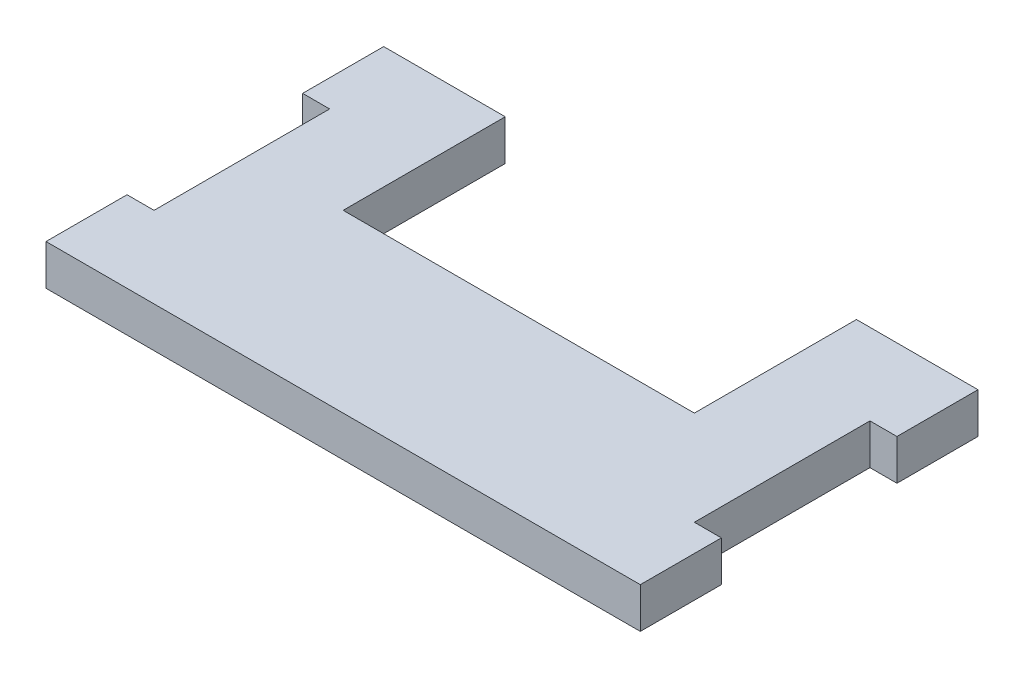
ISO-10303-21;
HEADER;
FILE_DESCRIPTION(('STEP AP214'),'2;1');
FILE_NAME('part.step','',(''),(''),'','','');
FILE_SCHEMA(('AUTOMOTIVE_DESIGN { 1 0 10303 214 1 1 1 1 }'));
ENDSEC;
DATA;
#1=APPLICATION_CONTEXT('core data for automotive mechanical design processes');
#2=APPLICATION_PROTOCOL_DEFINITION('international standard','automotive_design',2000,#1);
#3=PRODUCT_CONTEXT('',#1,'mechanical');
#4=PRODUCT('Part','Part','',(#3));
#5=PRODUCT_RELATED_PRODUCT_CATEGORY('part','',(#4));
#6=PRODUCT_DEFINITION_FORMATION('','',#4);
#7=PRODUCT_DEFINITION_CONTEXT('part definition',#1,'design');
#8=PRODUCT_DEFINITION('design','',#6,#7);
#9=PRODUCT_DEFINITION_SHAPE('','',#8);
#10=(LENGTH_UNIT() NAMED_UNIT(*) SI_UNIT(.MILLI.,.METRE.));
#11=(NAMED_UNIT(*) PLANE_ANGLE_UNIT() SI_UNIT($,.RADIAN.));
#12=(NAMED_UNIT(*) SI_UNIT($,.STERADIAN.) SOLID_ANGLE_UNIT());
#13=UNCERTAINTY_MEASURE_WITH_UNIT(LENGTH_MEASURE(1.E-05),#10,'distance_accuracy_value','');
#14=(GEOMETRIC_REPRESENTATION_CONTEXT(3) GLOBAL_UNCERTAINTY_ASSIGNED_CONTEXT((#13)) GLOBAL_UNIT_ASSIGNED_CONTEXT((#10,
#11,#12)) REPRESENTATION_CONTEXT('',''));
#15=CARTESIAN_POINT('',(0.,0.,0.));
#16=DIRECTION('',(0.,0.,1.));
#17=DIRECTION('',(1.,0.,0.));
#18=AXIS2_PLACEMENT_3D('',#15,#16,#17);
#19=CARTESIAN_POINT('',(0.,3.,-25.));
#20=DIRECTION('',(0.,0.,-1.));
#21=DIRECTION('',(-1.,0.,0.));
#22=AXIS2_PLACEMENT_3D('',#19,#20,#21);
#23=PLANE('',#22);
#24=DIRECTION('',(1.,0.,0.));
#25=VECTOR('',#24,1.);
#26=CARTESIAN_POINT('',(0.,0.,-25.));
#27=LINE('',#26,#25);
#28=CARTESIAN_POINT('',(33.,0.,-25.));
#29=VERTEX_POINT('',#28);
#30=CARTESIAN_POINT('',(42.,0.,-25.));
#31=VERTEX_POINT('',#30);
#32=EDGE_CURVE('E178',#29,#31,#27,.T.);
#33=ORIENTED_EDGE('',*,*,#32,.F.);
#34=DIRECTION('',(0.,-1.,0.));
#35=VECTOR('',#34,1.);
#36=CARTESIAN_POINT('',(33.,3.,-25.));
#37=LINE('',#36,#35);
#38=CARTESIAN_POINT('',(33.,3.,-25.));
#39=VERTEX_POINT('',#38);
#40=EDGE_CURVE('E11',#39,#29,#37,.T.);
#41=ORIENTED_EDGE('',*,*,#40,.F.);
#42=DIRECTION('',(1.,0.,0.));
#43=VECTOR('',#42,1.);
#44=CARTESIAN_POINT('',(0.,3.,-25.));
#45=LINE('',#44,#43);
#46=CARTESIAN_POINT('',(42.,3.,-25.));
#47=VERTEX_POINT('',#46);
#48=EDGE_CURVE('E219',#39,#47,#45,.T.);
#49=ORIENTED_EDGE('',*,*,#48,.T.);
#50=DIRECTION('',(0.,-1.,0.));
#51=VECTOR('',#50,1.);
#52=CARTESIAN_POINT('',(42.,3.,-25.));
#53=LINE('',#52,#51);
#54=EDGE_CURVE('E53',#47,#31,#53,.T.);
#55=ORIENTED_EDGE('',*,*,#54,.T.);
#56=EDGE_LOOP('',(#33,#41,#49,#55));
#57=FACE_BOUND('',#56,.T.);
#58=ADVANCED_FACE('F36',(#57),#23,.T.);
#59=CARTESIAN_POINT('',(33.,3.,0.));
#60=DIRECTION('',(1.,0.,0.));
#61=DIRECTION('',(0.,0.,-1.));
#62=AXIS2_PLACEMENT_3D('',#59,#60,#61);
#63=PLANE('',#62);
#64=DIRECTION('',(0.,0.,1.));
#65=VECTOR('',#64,1.);
#66=CARTESIAN_POINT('',(33.,0.,0.));
#67=LINE('',#66,#65);
#68=CARTESIAN_POINT('',(33.,0.,-13.));
#69=VERTEX_POINT('',#68);
#70=EDGE_CURVE('E180',#29,#69,#67,.T.);
#71=ORIENTED_EDGE('',*,*,#70,.T.);
#72=DIRECTION('',(0.,-1.,0.));
#73=VECTOR('',#72,1.);
#74=CARTESIAN_POINT('',(33.,3.,-13.));
#75=LINE('',#74,#73);
#76=CARTESIAN_POINT('',(33.,3.,-13.));
#77=VERTEX_POINT('',#76);
#78=EDGE_CURVE('E45',#77,#69,#75,.T.);
#79=ORIENTED_EDGE('',*,*,#78,.F.);
#80=DIRECTION('',(0.,0.,1.));
#81=VECTOR('',#80,1.);
#82=CARTESIAN_POINT('',(33.,3.,0.));
#83=LINE('',#82,#81);
#84=EDGE_CURVE('E265',#39,#77,#83,.T.);
#85=ORIENTED_EDGE('',*,*,#84,.F.);
#86=ORIENTED_EDGE('',*,*,#40,.T.);
#87=EDGE_LOOP('',(#71,#79,#85,#86));
#88=FACE_BOUND('',#87,.T.);
#89=ADVANCED_FACE('F38',(#88),#63,.F.);
#90=CARTESIAN_POINT('',(0.,3.,-13.));
#91=DIRECTION('',(0.,0.,-1.));
#92=DIRECTION('',(-1.,0.,0.));
#93=AXIS2_PLACEMENT_3D('',#90,#91,#92);
#94=PLANE('',#93);
#95=DIRECTION('',(1.,0.,0.));
#96=VECTOR('',#95,1.);
#97=CARTESIAN_POINT('',(0.,0.,-13.));
#98=LINE('',#97,#96);
#99=CARTESIAN_POINT('',(6.99999999999999,0.,-13.));
#100=VERTEX_POINT('',#99);
#101=EDGE_CURVE('E184',#100,#69,#98,.T.);
#102=ORIENTED_EDGE('',*,*,#101,.F.);
#103=DIRECTION('',(0.,-1.,0.));
#104=VECTOR('',#103,1.);
#105=CARTESIAN_POINT('',(6.99999999999999,3.,-13.));
#106=LINE('',#105,#104);
#107=CARTESIAN_POINT('',(6.99999999999999,3.,-13.));
#108=VERTEX_POINT('',#107);
#109=EDGE_CURVE('E242',#108,#100,#106,.T.);
#110=ORIENTED_EDGE('',*,*,#109,.F.);
#111=DIRECTION('',(1.,0.,0.));
#112=VECTOR('',#111,1.);
#113=CARTESIAN_POINT('',(0.,3.,-13.));
#114=LINE('',#113,#112);
#115=EDGE_CURVE('E249',#108,#77,#114,.T.);
#116=ORIENTED_EDGE('',*,*,#115,.T.);
#117=ORIENTED_EDGE('',*,*,#78,.T.);
#118=EDGE_LOOP('',(#102,#110,#116,#117));
#119=FACE_BOUND('',#118,.T.);
#120=ADVANCED_FACE('F247',(#119),#94,.T.);
#121=CARTESIAN_POINT('',(6.99999999999999,3.,0.));
#122=DIRECTION('',(1.,0.,0.));
#123=DIRECTION('',(0.,0.,-1.));
#124=AXIS2_PLACEMENT_3D('',#121,#122,#123);
#125=PLANE('',#124);
#126=DIRECTION('',(0.,0.,1.));
#127=VECTOR('',#126,1.);
#128=CARTESIAN_POINT('',(6.99999999999999,0.,0.));
#129=LINE('',#128,#127);
#130=CARTESIAN_POINT('',(6.99999999999999,0.,-25.));
#131=VERTEX_POINT('',#130);
#132=EDGE_CURVE('E187',#131,#100,#129,.T.);
#133=ORIENTED_EDGE('',*,*,#132,.F.);
#134=DIRECTION('',(0.,-1.,0.));
#135=VECTOR('',#134,1.);
#136=CARTESIAN_POINT('',(6.99999999999999,3.,-25.));
#137=LINE('',#136,#135);
#138=CARTESIAN_POINT('',(6.99999999999999,3.,-25.));
#139=VERTEX_POINT('',#138);
#140=EDGE_CURVE('E240',#139,#131,#137,.T.);
#141=ORIENTED_EDGE('',*,*,#140,.F.);
#142=DIRECTION('',(0.,0.,1.));
#143=VECTOR('',#142,1.);
#144=CARTESIAN_POINT('',(6.99999999999999,3.,0.));
#145=LINE('',#144,#143);
#146=EDGE_CURVE('E262',#139,#108,#145,.T.);
#147=ORIENTED_EDGE('',*,*,#146,.T.);
#148=ORIENTED_EDGE('',*,*,#109,.T.);
#149=EDGE_LOOP('',(#133,#141,#147,#148));
#150=FACE_BOUND('',#149,.T.);
#151=ADVANCED_FACE('F259',(#150),#125,.T.);
#152=CARTESIAN_POINT('',(-2.,0.,-25.));
#153=VERTEX_POINT('',#152);
#154=EDGE_CURVE('E181',#153,#131,#27,.T.);
#155=ORIENTED_EDGE('',*,*,#154,.F.);
#156=DIRECTION('',(0.,-1.,0.));
#157=VECTOR('',#156,1.);
#158=CARTESIAN_POINT('',(-2.,3.,-25.));
#159=LINE('',#158,#157);
#160=CARTESIAN_POINT('',(-2.,3.,-25.));
#161=VERTEX_POINT('',#160);
#162=EDGE_CURVE('E238',#161,#153,#159,.T.);
#163=ORIENTED_EDGE('',*,*,#162,.F.);
#164=EDGE_CURVE('E267',#161,#139,#45,.T.);
#165=ORIENTED_EDGE('',*,*,#164,.T.);
#166=ORIENTED_EDGE('',*,*,#140,.T.);
#167=EDGE_LOOP('',(#155,#163,#165,#166));
#168=FACE_BOUND('',#167,.T.);
#169=ADVANCED_FACE('F305',(#168),#23,.T.);
#170=CARTESIAN_POINT('',(-2.00000000000001,3.,0.));
#171=DIRECTION('',(1.,0.,0.));
#172=DIRECTION('',(0.,0.,-1.));
#173=AXIS2_PLACEMENT_3D('',#170,#171,#172);
#174=PLANE('',#173);
#175=DIRECTION('',(0.,0.,1.));
#176=VECTOR('',#175,1.);
#177=CARTESIAN_POINT('',(-2.00000000000001,0.,0.));
#178=LINE('',#177,#176);
#179=CARTESIAN_POINT('',(-2.,0.,-19.));
#180=VERTEX_POINT('',#179);
#181=EDGE_CURVE('E190',#153,#180,#178,.T.);
#182=ORIENTED_EDGE('',*,*,#181,.T.);
#183=DIRECTION('',(0.,-1.,0.));
#184=VECTOR('',#183,1.);
#185=CARTESIAN_POINT('',(-2.,3.,-19.));
#186=LINE('',#185,#184);
#187=CARTESIAN_POINT('',(-2.,3.,-19.));
#188=VERTEX_POINT('',#187);
#189=EDGE_CURVE('E236',#188,#180,#186,.T.);
#190=ORIENTED_EDGE('',*,*,#189,.F.);
#191=DIRECTION('',(0.,0.,1.));
#192=VECTOR('',#191,1.);
#193=CARTESIAN_POINT('',(-2.00000000000001,3.,0.));
#194=LINE('',#193,#192);
#195=EDGE_CURVE('E272',#161,#188,#194,.T.);
#196=ORIENTED_EDGE('',*,*,#195,.F.);
#197=ORIENTED_EDGE('',*,*,#162,.T.);
#198=EDGE_LOOP('',(#182,#190,#196,#197));
#199=FACE_BOUND('',#198,.T.);
#200=ADVANCED_FACE('F312',(#199),#174,.F.);
#201=CARTESIAN_POINT('',(0.,3.,-19.));
#202=DIRECTION('',(0.,0.,1.));
#203=DIRECTION('',(1.,0.,0.));
#204=AXIS2_PLACEMENT_3D('',#201,#202,#203);
#205=PLANE('',#204);
#206=DIRECTION('',(-1.,0.,0.));
#207=VECTOR('',#206,1.);
#208=CARTESIAN_POINT('',(0.,0.,-19.));
#209=LINE('',#208,#207);
#210=CARTESIAN_POINT('',(0.,0.,-19.));
#211=VERTEX_POINT('',#210);
#212=EDGE_CURVE('E193',#211,#180,#209,.T.);
#213=ORIENTED_EDGE('',*,*,#212,.F.);
#214=DIRECTION('',(0.,-1.,0.));
#215=VECTOR('',#214,1.);
#216=CARTESIAN_POINT('',(0.,3.,-19.));
#217=LINE('',#216,#215);
#218=CARTESIAN_POINT('',(0.,3.,-19.));
#219=VERTEX_POINT('',#218);
#220=EDGE_CURVE('E234',#219,#211,#217,.T.);
#221=ORIENTED_EDGE('',*,*,#220,.F.);
#222=DIRECTION('',(-1.,0.,0.));
#223=VECTOR('',#222,1.);
#224=CARTESIAN_POINT('',(0.,3.,-19.));
#225=LINE('',#224,#223);
#226=EDGE_CURVE('E274',#219,#188,#225,.T.);
#227=ORIENTED_EDGE('',*,*,#226,.T.);
#228=ORIENTED_EDGE('',*,*,#189,.T.);
#229=EDGE_LOOP('',(#213,#221,#227,#228));
#230=FACE_BOUND('',#229,.T.);
#231=ADVANCED_FACE('F318',(#230),#205,.T.);
#232=CARTESIAN_POINT('',(0.,3.,0.));
#233=DIRECTION('',(-1.,0.,0.));
#234=DIRECTION('',(0.,0.,1.));
#235=AXIS2_PLACEMENT_3D('',#232,#233,#234);
#236=PLANE('',#235);
#237=DIRECTION('',(0.,0.,-1.));
#238=VECTOR('',#237,1.);
#239=CARTESIAN_POINT('',(0.,0.,0.));
#240=LINE('',#239,#238);
#241=CARTESIAN_POINT('',(0.,0.,-5.99999999999999));
#242=VERTEX_POINT('',#241);
#243=EDGE_CURVE('E196',#242,#211,#240,.T.);
#244=ORIENTED_EDGE('',*,*,#243,.F.);
#245=DIRECTION('',(0.,-1.,0.));
#246=VECTOR('',#245,1.);
#247=CARTESIAN_POINT('',(0.,3.,-5.99999999999999));
#248=LINE('',#247,#246);
#249=CARTESIAN_POINT('',(0.,3.,-5.99999999999999));
#250=VERTEX_POINT('',#249);
#251=EDGE_CURVE('E232',#250,#242,#248,.T.);
#252=ORIENTED_EDGE('',*,*,#251,.F.);
#253=DIRECTION('',(0.,0.,-1.));
#254=VECTOR('',#253,1.);
#255=CARTESIAN_POINT('',(0.,3.,0.));
#256=LINE('',#255,#254);
#257=EDGE_CURVE('E277',#250,#219,#256,.T.);
#258=ORIENTED_EDGE('',*,*,#257,.T.);
#259=ORIENTED_EDGE('',*,*,#220,.T.);
#260=EDGE_LOOP('',(#244,#252,#258,#259));
#261=FACE_BOUND('',#260,.T.);
#262=ADVANCED_FACE('F328',(#261),#236,.T.);
#263=CARTESIAN_POINT('',(0.,3.,-6.));
#264=DIRECTION('',(0.,0.,1.));
#265=DIRECTION('',(1.,0.,0.));
#266=AXIS2_PLACEMENT_3D('',#263,#264,#265);
#267=PLANE('',#266);
#268=DIRECTION('',(-1.,0.,0.));
#269=VECTOR('',#268,1.);
#270=CARTESIAN_POINT('',(0.,0.,-6.));
#271=LINE('',#270,#269);
#272=CARTESIAN_POINT('',(-2.,0.,-5.99999999999999));
#273=VERTEX_POINT('',#272);
#274=EDGE_CURVE('E199',#242,#273,#271,.T.);
#275=ORIENTED_EDGE('',*,*,#274,.T.);
#276=DIRECTION('',(0.,-1.,0.));
#277=VECTOR('',#276,1.);
#278=CARTESIAN_POINT('',(-2.,3.,-5.99999999999999));
#279=LINE('',#278,#277);
#280=CARTESIAN_POINT('',(-2.,3.,-5.99999999999999));
#281=VERTEX_POINT('',#280);
#282=EDGE_CURVE('E230',#281,#273,#279,.T.);
#283=ORIENTED_EDGE('',*,*,#282,.F.);
#284=DIRECTION('',(-1.,0.,0.));
#285=VECTOR('',#284,1.);
#286=CARTESIAN_POINT('',(0.,3.,-6.));
#287=LINE('',#286,#285);
#288=EDGE_CURVE('E280',#250,#281,#287,.T.);
#289=ORIENTED_EDGE('',*,*,#288,.F.);
#290=ORIENTED_EDGE('',*,*,#251,.T.);
#291=EDGE_LOOP('',(#275,#283,#289,#290));
#292=FACE_BOUND('',#291,.T.);
#293=ADVANCED_FACE('F333',(#292),#267,.F.);
#294=CARTESIAN_POINT('',(-2.,3.,0.));
#295=DIRECTION('',(-1.,0.,0.));
#296=DIRECTION('',(0.,0.,1.));
#297=AXIS2_PLACEMENT_3D('',#294,#295,#296);
#298=PLANE('',#297);
#299=DIRECTION('',(0.,0.,-1.));
#300=VECTOR('',#299,1.);
#301=CARTESIAN_POINT('',(-2.,0.,0.));
#302=LINE('',#301,#300);
#303=CARTESIAN_POINT('',(-2.,0.,0.));
#304=VERTEX_POINT('',#303);
#305=EDGE_CURVE('E202',#304,#273,#302,.T.);
#306=ORIENTED_EDGE('',*,*,#305,.F.);
#307=DIRECTION('',(0.,-1.,0.));
#308=VECTOR('',#307,1.);
#309=CARTESIAN_POINT('',(-2.,3.,0.));
#310=LINE('',#309,#308);
#311=CARTESIAN_POINT('',(-2.,3.,0.));
#312=VERTEX_POINT('',#311);
#313=EDGE_CURVE('E228',#312,#304,#310,.T.);
#314=ORIENTED_EDGE('',*,*,#313,.F.);
#315=DIRECTION('',(0.,0.,-1.));
#316=VECTOR('',#315,1.);
#317=CARTESIAN_POINT('',(-2.,3.,0.));
#318=LINE('',#317,#316);
#319=EDGE_CURVE('E282',#312,#281,#318,.T.);
#320=ORIENTED_EDGE('',*,*,#319,.T.);
#321=ORIENTED_EDGE('',*,*,#282,.T.);
#322=EDGE_LOOP('',(#306,#314,#320,#321));
#323=FACE_BOUND('',#322,.T.);
#324=ADVANCED_FACE('F337',(#323),#298,.T.);
#325=CARTESIAN_POINT('',(0.,3.,0.));
#326=DIRECTION('',(0.,0.,-1.));
#327=DIRECTION('',(-1.,0.,0.));
#328=AXIS2_PLACEMENT_3D('',#325,#326,#327);
#329=PLANE('',#328);
#330=DIRECTION('',(1.,0.,0.));
#331=VECTOR('',#330,1.);
#332=CARTESIAN_POINT('',(0.,0.,0.));
#333=LINE('',#332,#331);
#334=CARTESIAN_POINT('',(42.,0.,0.));
#335=VERTEX_POINT('',#334);
#336=EDGE_CURVE('E205',#304,#335,#333,.T.);
#337=ORIENTED_EDGE('',*,*,#336,.T.);
#338=DIRECTION('',(0.,-1.,0.));
#339=VECTOR('',#338,1.);
#340=CARTESIAN_POINT('',(42.,3.,0.));
#341=LINE('',#340,#339);
#342=CARTESIAN_POINT('',(42.,3.,0.));
#343=VERTEX_POINT('',#342);
#344=EDGE_CURVE('E225',#343,#335,#341,.T.);
#345=ORIENTED_EDGE('',*,*,#344,.F.);
#346=DIRECTION('',(1.,0.,0.));
#347=VECTOR('',#346,1.);
#348=CARTESIAN_POINT('',(0.,3.,0.));
#349=LINE('',#348,#347);
#350=EDGE_CURVE('E285',#312,#343,#349,.T.);
#351=ORIENTED_EDGE('',*,*,#350,.F.);
#352=ORIENTED_EDGE('',*,*,#313,.T.);
#353=EDGE_LOOP('',(#337,#345,#351,#352));
#354=FACE_BOUND('',#353,.T.);
#355=ADVANCED_FACE('F342',(#354),#329,.F.);
#356=CARTESIAN_POINT('',(42.,3.,0.));
#357=DIRECTION('',(-1.,0.,0.));
#358=DIRECTION('',(0.,0.,1.));
#359=AXIS2_PLACEMENT_3D('',#356,#357,#358);
#360=PLANE('',#359);
#361=DIRECTION('',(0.,0.,-1.));
#362=VECTOR('',#361,1.);
#363=CARTESIAN_POINT('',(42.,0.,0.));
#364=LINE('',#363,#362);
#365=CARTESIAN_POINT('',(42.,0.,-6.));
#366=VERTEX_POINT('',#365);
#367=EDGE_CURVE('E207',#335,#366,#364,.T.);
#368=ORIENTED_EDGE('',*,*,#367,.T.);
#369=DIRECTION('',(0.,-1.,0.));
#370=VECTOR('',#369,1.);
#371=CARTESIAN_POINT('',(42.,3.,-6.));
#372=LINE('',#371,#370);
#373=CARTESIAN_POINT('',(42.,3.,-6.));
#374=VERTEX_POINT('',#373);
#375=EDGE_CURVE('E223',#374,#366,#372,.T.);
#376=ORIENTED_EDGE('',*,*,#375,.F.);
#377=DIRECTION('',(0.,0.,-1.));
#378=VECTOR('',#377,1.);
#379=CARTESIAN_POINT('',(42.,3.,0.));
#380=LINE('',#379,#378);
#381=EDGE_CURVE('E287',#343,#374,#380,.T.);
#382=ORIENTED_EDGE('',*,*,#381,.F.);
#383=ORIENTED_EDGE('',*,*,#344,.T.);
#384=EDGE_LOOP('',(#368,#376,#382,#383));
#385=FACE_BOUND('',#384,.T.);
#386=ADVANCED_FACE('F345',(#385),#360,.F.);
#387=CARTESIAN_POINT('',(0.,3.,-6.00000000000003));
#388=DIRECTION('',(0.,0.,-1.));
#389=DIRECTION('',(-1.,0.,0.));
#390=AXIS2_PLACEMENT_3D('',#387,#388,#389);
#391=PLANE('',#390);
#392=DIRECTION('',(1.,0.,0.));
#393=VECTOR('',#392,1.);
#394=CARTESIAN_POINT('',(0.,0.,-6.00000000000003));
#395=LINE('',#394,#393);
#396=CARTESIAN_POINT('',(40.,0.,-6.));
#397=VERTEX_POINT('',#396);
#398=EDGE_CURVE('E210',#397,#366,#395,.T.);
#399=ORIENTED_EDGE('',*,*,#398,.F.);
#400=DIRECTION('',(0.,-1.,0.));
#401=VECTOR('',#400,1.);
#402=CARTESIAN_POINT('',(40.,3.,-6.));
#403=LINE('',#402,#401);
#404=CARTESIAN_POINT('',(40.,3.,-6.));
#405=VERTEX_POINT('',#404);
#406=EDGE_CURVE('E170',#405,#397,#403,.T.);
#407=ORIENTED_EDGE('',*,*,#406,.F.);
#408=DIRECTION('',(1.,0.,0.));
#409=VECTOR('',#408,1.);
#410=CARTESIAN_POINT('',(0.,3.,-6.00000000000003));
#411=LINE('',#410,#409);
#412=EDGE_CURVE('E160',#405,#374,#411,.T.);
#413=ORIENTED_EDGE('',*,*,#412,.T.);
#414=ORIENTED_EDGE('',*,*,#375,.T.);
#415=EDGE_LOOP('',(#399,#407,#413,#414));
#416=FACE_BOUND('',#415,.T.);
#417=ADVANCED_FACE('F290',(#416),#391,.T.);
#418=CARTESIAN_POINT('',(40.,3.,0.));
#419=DIRECTION('',(-1.,0.,0.));
#420=DIRECTION('',(0.,0.,1.));
#421=AXIS2_PLACEMENT_3D('',#418,#419,#420);
#422=PLANE('',#421);
#423=DIRECTION('',(0.,0.,-1.));
#424=VECTOR('',#423,1.);
#425=CARTESIAN_POINT('',(40.,0.,0.));
#426=LINE('',#425,#424);
#427=CARTESIAN_POINT('',(40.,0.,-19.));
#428=VERTEX_POINT('',#427);
#429=EDGE_CURVE('E167',#397,#428,#426,.T.);
#430=ORIENTED_EDGE('',*,*,#429,.T.);
#431=DIRECTION('',(0.,-1.,0.));
#432=VECTOR('',#431,1.);
#433=CARTESIAN_POINT('',(40.,3.,-19.));
#434=LINE('',#433,#432);
#435=CARTESIAN_POINT('',(40.,3.,-19.));
#436=VERTEX_POINT('',#435);
#437=EDGE_CURVE('E164',#436,#428,#434,.T.);
#438=ORIENTED_EDGE('',*,*,#437,.F.);
#439=DIRECTION('',(0.,0.,-1.));
#440=VECTOR('',#439,1.);
#441=CARTESIAN_POINT('',(40.,3.,0.));
#442=LINE('',#441,#440);
#443=EDGE_CURVE('E152',#405,#436,#442,.T.);
#444=ORIENTED_EDGE('',*,*,#443,.F.);
#445=ORIENTED_EDGE('',*,*,#406,.T.);
#446=EDGE_LOOP('',(#430,#438,#444,#445));
#447=FACE_BOUND('',#446,.T.);
#448=ADVANCED_FACE('F165',(#447),#422,.F.);
#449=CARTESIAN_POINT('',(0.,3.,-19.));
#450=DIRECTION('',(0.,0.,-1.));
#451=DIRECTION('',(-1.,0.,0.));
#452=AXIS2_PLACEMENT_3D('',#449,#450,#451);
#453=PLANE('',#452);
#454=DIRECTION('',(1.,0.,0.));
#455=VECTOR('',#454,1.);
#456=CARTESIAN_POINT('',(0.,0.,-19.));
#457=LINE('',#456,#455);
#458=CARTESIAN_POINT('',(42.,0.,-19.));
#459=VERTEX_POINT('',#458);
#460=EDGE_CURVE('E214',#428,#459,#457,.T.);
#461=ORIENTED_EDGE('',*,*,#460,.T.);
#462=DIRECTION('',(0.,-1.,0.));
#463=VECTOR('',#462,1.);
#464=CARTESIAN_POINT('',(42.,3.,-19.));
#465=LINE('',#464,#463);
#466=CARTESIAN_POINT('',(42.,3.,-19.));
#467=VERTEX_POINT('',#466);
#468=EDGE_CURVE('E103',#467,#459,#465,.T.);
#469=ORIENTED_EDGE('',*,*,#468,.F.);
#470=DIRECTION('',(1.,0.,0.));
#471=VECTOR('',#470,1.);
#472=CARTESIAN_POINT('',(0.,3.,-19.));
#473=LINE('',#472,#471);
#474=EDGE_CURVE('E158',#436,#467,#473,.T.);
#475=ORIENTED_EDGE('',*,*,#474,.F.);
#476=ORIENTED_EDGE('',*,*,#437,.T.);
#477=EDGE_LOOP('',(#461,#469,#475,#476));
#478=FACE_BOUND('',#477,.T.);
#479=ADVANCED_FACE('F172',(#478),#453,.F.);
#480=CARTESIAN_POINT('',(42.,3.,0.));
#481=DIRECTION('',(1.,0.,0.));
#482=DIRECTION('',(0.,0.,-1.));
#483=AXIS2_PLACEMENT_3D('',#480,#481,#482);
#484=PLANE('',#483);
#485=DIRECTION('',(0.,0.,1.));
#486=VECTOR('',#485,1.);
#487=CARTESIAN_POINT('',(42.,0.,0.));
#488=LINE('',#487,#486);
#489=EDGE_CURVE('E216',#31,#459,#488,.T.);
#490=ORIENTED_EDGE('',*,*,#489,.F.);
#491=ORIENTED_EDGE('',*,*,#54,.F.);
#492=DIRECTION('',(0.,0.,1.));
#493=VECTOR('',#492,1.);
#494=CARTESIAN_POINT('',(42.,3.,0.));
#495=LINE('',#494,#493);
#496=EDGE_CURVE('E173',#47,#467,#495,.T.);
#497=ORIENTED_EDGE('',*,*,#496,.T.);
#498=ORIENTED_EDGE('',*,*,#468,.T.);
#499=EDGE_LOOP('',(#490,#491,#497,#498));
#500=FACE_BOUND('',#499,.T.);
#501=ADVANCED_FACE('F293',(#500),#484,.T.);
#502=CARTESIAN_POINT('',(0.,3.,0.));
#503=DIRECTION('',(0.,1.,0.));
#504=DIRECTION('',(0.,0.,1.));
#505=AXIS2_PLACEMENT_3D('',#502,#503,#504);
#506=PLANE('',#505);
#507=ORIENTED_EDGE('',*,*,#48,.F.);
#508=ORIENTED_EDGE('',*,*,#84,.T.);
#509=ORIENTED_EDGE('',*,*,#115,.F.);
#510=ORIENTED_EDGE('',*,*,#146,.F.);
#511=ORIENTED_EDGE('',*,*,#164,.F.);
#512=ORIENTED_EDGE('',*,*,#195,.T.);
#513=ORIENTED_EDGE('',*,*,#226,.F.);
#514=ORIENTED_EDGE('',*,*,#257,.F.);
#515=ORIENTED_EDGE('',*,*,#288,.T.);
#516=ORIENTED_EDGE('',*,*,#319,.F.);
#517=ORIENTED_EDGE('',*,*,#350,.T.);
#518=ORIENTED_EDGE('',*,*,#381,.T.);
#519=ORIENTED_EDGE('',*,*,#412,.F.);
#520=ORIENTED_EDGE('',*,*,#443,.T.);
#521=ORIENTED_EDGE('',*,*,#474,.T.);
#522=ORIENTED_EDGE('',*,*,#496,.F.);
#523=EDGE_LOOP('',(#507,#508,#509,#510,#511,#512,#513,#514,#515,#516,#517,#518,#519,#520,#521,#522));
#524=FACE_BOUND('',#523,.T.);
#525=ADVANCED_FACE('F155',(#524),#506,.T.);
#526=CARTESIAN_POINT('',(0.,0.,0.));
#527=DIRECTION('',(0.,1.,0.));
#528=DIRECTION('',(0.,0.,1.));
#529=AXIS2_PLACEMENT_3D('',#526,#527,#528);
#530=PLANE('',#529);
#531=ORIENTED_EDGE('',*,*,#32,.T.);
#532=ORIENTED_EDGE('',*,*,#489,.T.);
#533=ORIENTED_EDGE('',*,*,#460,.F.);
#534=ORIENTED_EDGE('',*,*,#429,.F.);
#535=ORIENTED_EDGE('',*,*,#398,.T.);
#536=ORIENTED_EDGE('',*,*,#367,.F.);
#537=ORIENTED_EDGE('',*,*,#336,.F.);
#538=ORIENTED_EDGE('',*,*,#305,.T.);
#539=ORIENTED_EDGE('',*,*,#274,.F.);
#540=ORIENTED_EDGE('',*,*,#243,.T.);
#541=ORIENTED_EDGE('',*,*,#212,.T.);
#542=ORIENTED_EDGE('',*,*,#181,.F.);
#543=ORIENTED_EDGE('',*,*,#154,.T.);
#544=ORIENTED_EDGE('',*,*,#132,.T.);
#545=ORIENTED_EDGE('',*,*,#101,.T.);
#546=ORIENTED_EDGE('',*,*,#70,.F.);
#547=EDGE_LOOP('',(#531,#532,#533,#534,#535,#536,#537,#538,#539,#540,#541,#542,#543,#544,#545,#546));
#548=FACE_BOUND('',#547,.T.);
#549=ADVANCED_FACE('F253',(#548),#530,.F.);
#550=CLOSED_SHELL('',(#58,#89,#120,#151,#169,#200,#231,#262,#293,#324,#355,#386,#417,#448,#479,
#501,#525,#549));
#551=MANIFOLD_SOLID_BREP('B2',#550);
#552=ADVANCED_BREP_SHAPE_REPRESENTATION('',(#18,#551),#14);
#553=SHAPE_DEFINITION_REPRESENTATION(#9,#552);
ENDSEC;
END-ISO-10303-21;
